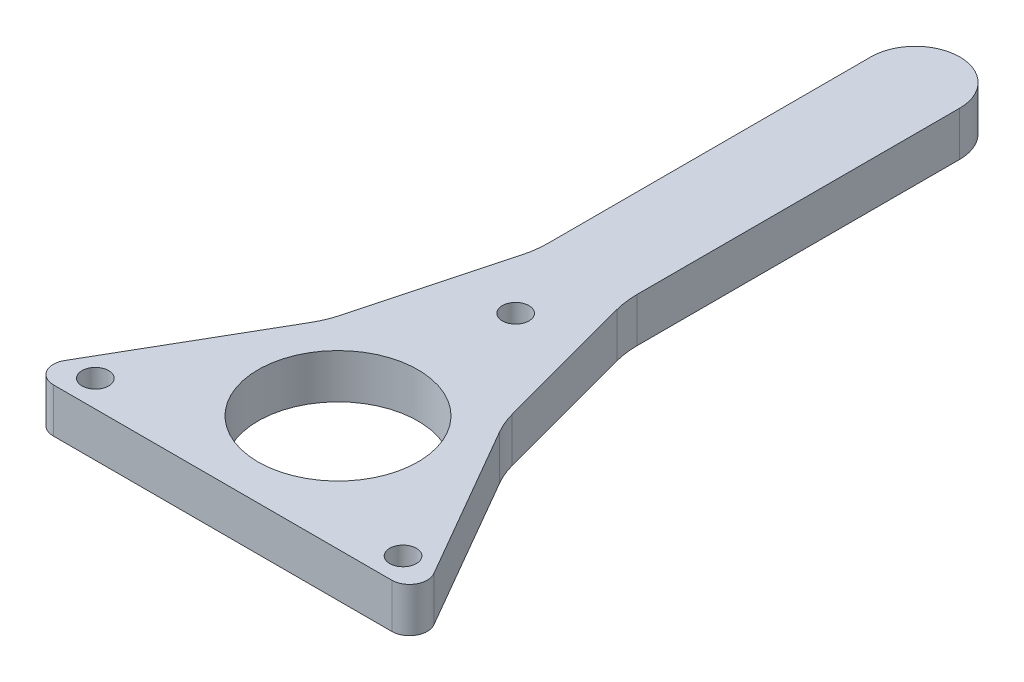
ISO-10303-21;
HEADER;
FILE_DESCRIPTION(('STEP AP214'),'2;1');
FILE_NAME('part.step','',(''),(''),'','','');
FILE_SCHEMA(('AUTOMOTIVE_DESIGN { 1 0 10303 214 1 1 1 1 }'));
ENDSEC;
DATA;
#1=APPLICATION_CONTEXT('core data for automotive mechanical design processes');
#2=APPLICATION_PROTOCOL_DEFINITION('international standard','automotive_design',2000,#1);
#3=PRODUCT_CONTEXT('',#1,'mechanical');
#4=PRODUCT('Part','Part','',(#3));
#5=PRODUCT_RELATED_PRODUCT_CATEGORY('part','',(#4));
#6=PRODUCT_DEFINITION_FORMATION('','',#4);
#7=PRODUCT_DEFINITION_CONTEXT('part definition',#1,'design');
#8=PRODUCT_DEFINITION('design','',#6,#7);
#9=PRODUCT_DEFINITION_SHAPE('','',#8);
#10=(LENGTH_UNIT() NAMED_UNIT(*) SI_UNIT(.MILLI.,.METRE.));
#11=(NAMED_UNIT(*) PLANE_ANGLE_UNIT() SI_UNIT($,.RADIAN.));
#12=(NAMED_UNIT(*) SI_UNIT($,.STERADIAN.) SOLID_ANGLE_UNIT());
#13=UNCERTAINTY_MEASURE_WITH_UNIT(LENGTH_MEASURE(1.E-05),#10,'distance_accuracy_value','');
#14=(GEOMETRIC_REPRESENTATION_CONTEXT(3) GLOBAL_UNCERTAINTY_ASSIGNED_CONTEXT((#13)) GLOBAL_UNIT_ASSIGNED_CONTEXT((#10,
#11,#12)) REPRESENTATION_CONTEXT('',''));
#15=CARTESIAN_POINT('',(0.,0.,0.));
#16=DIRECTION('',(0.,0.,1.));
#17=DIRECTION('',(1.,0.,0.));
#18=AXIS2_PLACEMENT_3D('',#15,#16,#17);
#19=CARTESIAN_POINT('',(11.2583302491977,5.,-6.5));
#20=DIRECTION('',(-0.866025403784439,0.,0.5));
#21=DIRECTION('',(0.5,0.,0.866025403784439));
#22=AXIS2_PLACEMENT_3D('',#19,#20,#21);
#23=PLANE('',#22);
#24=DIRECTION('',(-0.5,0.,-0.866025403784439));
#25=VECTOR('',#24,1.);
#26=CARTESIAN_POINT('',(11.2583302491977,0.,-6.5));
#27=LINE('',#26,#25);
#28=CARTESIAN_POINT('',(20.7846096908265,0.,10.));
#29=VERTEX_POINT('',#28);
#30=CARTESIAN_POINT('',(10.6582624879369,0.,-7.5393478504878));
#31=VERTEX_POINT('',#30);
#32=EDGE_CURVE('E197',#29,#31,#27,.T.);
#33=ORIENTED_EDGE('',*,*,#32,.T.);
#34=DIRECTION('',(0.,-1.,0.));
#35=VECTOR('',#34,1.);
#36=CARTESIAN_POINT('',(10.6582624879369,5.,-7.5393478504878));
#37=LINE('',#36,#35);
#38=CARTESIAN_POINT('',(10.6582624879369,5.,-7.5393478504878));
#39=VERTEX_POINT('',#38);
#40=EDGE_CURVE('E260',#31,#39,#37,.F.);
#41=ORIENTED_EDGE('',*,*,#40,.T.);
#42=DIRECTION('',(-0.5,0.,-0.866025403784439));
#43=VECTOR('',#42,1.);
#44=CARTESIAN_POINT('',(11.2583302491977,5.,-6.5));
#45=LINE('',#44,#43);
#46=CARTESIAN_POINT('',(20.7846096908265,5.,10.));
#47=VERTEX_POINT('',#46);
#48=EDGE_CURVE('E159',#47,#39,#45,.T.);
#49=ORIENTED_EDGE('',*,*,#48,.F.);
#50=DIRECTION('',(0.,-1.,0.));
#51=VECTOR('',#50,1.);
#52=CARTESIAN_POINT('',(20.7846096908265,5.,10.));
#53=LINE('',#52,#51);
#54=EDGE_CURVE('E238',#47,#29,#53,.T.);
#55=ORIENTED_EDGE('',*,*,#54,.T.);
#56=EDGE_LOOP('',(#33,#41,#49,#55));
#57=FACE_BOUND('',#56,.T.);
#58=ADVANCED_FACE('F44',(#57),#23,.F.);
#59=CARTESIAN_POINT('',(5.,5.,0.));
#60=DIRECTION('',(-1.,0.,0.));
#61=DIRECTION('',(0.,0.,1.));
#62=AXIS2_PLACEMENT_3D('',#59,#60,#61);
#63=PLANE('',#62);
#64=DIRECTION('',(0.,0.,-1.));
#65=VECTOR('',#64,1.);
#66=CARTESIAN_POINT('',(5.,5.,0.));
#67=LINE('',#66,#65);
#68=CARTESIAN_POINT('',(5.,5.,-28.6562709380294));
#69=VERTEX_POINT('',#68);
#70=CARTESIAN_POINT('',(5.,5.,-65.));
#71=VERTEX_POINT('',#70);
#72=EDGE_CURVE('E143',#69,#71,#67,.T.);
#73=ORIENTED_EDGE('',*,*,#72,.F.);
#74=DIRECTION('',(0.,1.,0.));
#75=VECTOR('',#74,1.);
#76=CARTESIAN_POINT('',(5.,0.,-28.6562709380294));
#77=LINE('',#76,#75);
#78=CARTESIAN_POINT('',(5.,0.,-28.6562709380294));
#79=VERTEX_POINT('',#78);
#80=EDGE_CURVE('E252',#69,#79,#77,.F.);
#81=ORIENTED_EDGE('',*,*,#80,.T.);
#82=DIRECTION('',(0.,0.,-1.));
#83=VECTOR('',#82,1.);
#84=CARTESIAN_POINT('',(5.,0.,0.));
#85=LINE('',#84,#83);
#86=CARTESIAN_POINT('',(5.,0.,-65.));
#87=VERTEX_POINT('',#86);
#88=EDGE_CURVE('E164',#79,#87,#85,.T.);
#89=ORIENTED_EDGE('',*,*,#88,.T.);
#90=DIRECTION('',(0.,-1.,0.));
#91=VECTOR('',#90,1.);
#92=CARTESIAN_POINT('',(5.,5.,-65.));
#93=LINE('',#92,#91);
#94=EDGE_CURVE('E162',#71,#87,#93,.T.);
#95=ORIENTED_EDGE('',*,*,#94,.F.);
#96=EDGE_LOOP('',(#73,#81,#89,#95));
#97=FACE_BOUND('',#96,.T.);
#98=ADVANCED_FACE('F161',(#97),#63,.F.);
#99=CARTESIAN_POINT('',(0.,5.,-65.));
#100=DIRECTION('',(0.,-1.,0.));
#101=DIRECTION('',(0.,0.,-1.));
#102=AXIS2_PLACEMENT_3D('',#99,#100,#101);
#103=CYLINDRICAL_SURFACE('',#102,5.);
#104=CARTESIAN_POINT('',(0.,0.,-65.));
#105=DIRECTION('',(0.,1.,0.));
#106=DIRECTION('',(0.,0.,1.));
#107=AXIS2_PLACEMENT_3D('',#104,#105,#106);
#108=CIRCLE('',#107,5.);
#109=CARTESIAN_POINT('',(-5.,0.,-65.));
#110=VERTEX_POINT('',#109);
#111=EDGE_CURVE('E198',#87,#110,#108,.T.);
#112=ORIENTED_EDGE('',*,*,#111,.T.);
#113=DIRECTION('',(0.,-1.,0.));
#114=VECTOR('',#113,1.);
#115=CARTESIAN_POINT('',(-5.,5.,-65.));
#116=LINE('',#115,#114);
#117=CARTESIAN_POINT('',(-5.,5.,-65.));
#118=VERTEX_POINT('',#117);
#119=EDGE_CURVE('E167',#118,#110,#116,.T.);
#120=ORIENTED_EDGE('',*,*,#119,.F.);
#121=CARTESIAN_POINT('',(0.,5.,-65.));
#122=DIRECTION('',(0.,1.,0.));
#123=DIRECTION('',(0.,0.,1.));
#124=AXIS2_PLACEMENT_3D('',#121,#122,#123);
#125=CIRCLE('',#124,5.);
#126=EDGE_CURVE('E152',#71,#118,#125,.T.);
#127=ORIENTED_EDGE('',*,*,#126,.F.);
#128=ORIENTED_EDGE('',*,*,#94,.T.);
#129=EDGE_LOOP('',(#112,#120,#127,#128));
#130=FACE_BOUND('',#129,.T.);
#131=ADVANCED_FACE('F175',(#130),#103,.T.);
#132=CARTESIAN_POINT('',(-5.,5.,0.));
#133=DIRECTION('',(-1.,0.,0.));
#134=DIRECTION('',(0.,0.,1.));
#135=AXIS2_PLACEMENT_3D('',#132,#133,#134);
#136=PLANE('',#135);
#137=DIRECTION('',(0.,0.,-1.));
#138=VECTOR('',#137,1.);
#139=CARTESIAN_POINT('',(-5.,0.,0.));
#140=LINE('',#139,#138);
#141=CARTESIAN_POINT('',(-5.,0.,-28.6562709380294));
#142=VERTEX_POINT('',#141);
#143=EDGE_CURVE('E205',#142,#110,#140,.T.);
#144=ORIENTED_EDGE('',*,*,#143,.F.);
#145=DIRECTION('',(0.,1.,0.));
#146=VECTOR('',#145,1.);
#147=CARTESIAN_POINT('',(-5.,5.,-28.6562709380294));
#148=LINE('',#147,#146);
#149=CARTESIAN_POINT('',(-5.,5.,-28.6562709380294));
#150=VERTEX_POINT('',#149);
#151=EDGE_CURVE('E270',#142,#150,#148,.T.);
#152=ORIENTED_EDGE('',*,*,#151,.T.);
#153=DIRECTION('',(0.,0.,-1.));
#154=VECTOR('',#153,1.);
#155=CARTESIAN_POINT('',(-5.,5.,0.));
#156=LINE('',#155,#154);
#157=EDGE_CURVE('E172',#150,#118,#156,.T.);
#158=ORIENTED_EDGE('',*,*,#157,.T.);
#159=ORIENTED_EDGE('',*,*,#119,.T.);
#160=EDGE_LOOP('',(#144,#152,#158,#159));
#161=FACE_BOUND('',#160,.T.);
#162=ADVANCED_FACE('F287',(#161),#136,.T.);
#163=CARTESIAN_POINT('',(-11.2583302491977,5.,-6.5));
#164=DIRECTION('',(0.866025403784439,0.,0.5));
#165=DIRECTION('',(0.5,0.,-0.866025403784439));
#166=AXIS2_PLACEMENT_3D('',#163,#164,#165);
#167=PLANE('',#166);
#168=DIRECTION('',(-0.5,0.,0.866025403784439));
#169=VECTOR('',#168,1.);
#170=CARTESIAN_POINT('',(-11.2583302491977,5.,-6.5));
#171=LINE('',#170,#169);
#172=CARTESIAN_POINT('',(-10.6582624879369,5.,-7.53934785048781));
#173=VERTEX_POINT('',#172);
#174=CARTESIAN_POINT('',(-20.7846096908265,5.,10.));
#175=VERTEX_POINT('',#174);
#176=EDGE_CURVE('E176',#173,#175,#171,.T.);
#177=ORIENTED_EDGE('',*,*,#176,.F.);
#178=DIRECTION('',(0.,-1.,0.));
#179=VECTOR('',#178,1.);
#180=CARTESIAN_POINT('',(-10.6582624879369,0.,-7.53934785048781));
#181=LINE('',#180,#179);
#182=CARTESIAN_POINT('',(-10.6582624879369,0.,-7.53934785048781));
#183=VERTEX_POINT('',#182);
#184=EDGE_CURVE('E258',#173,#183,#181,.T.);
#185=ORIENTED_EDGE('',*,*,#184,.T.);
#186=DIRECTION('',(-0.5,0.,0.866025403784439));
#187=VECTOR('',#186,1.);
#188=CARTESIAN_POINT('',(-11.2583302491977,0.,-6.5));
#189=LINE('',#188,#187);
#190=CARTESIAN_POINT('',(-20.7846096908265,0.,10.));
#191=VERTEX_POINT('',#190);
#192=EDGE_CURVE('E204',#183,#191,#189,.T.);
#193=ORIENTED_EDGE('',*,*,#192,.T.);
#194=DIRECTION('',(0.,-1.,0.));
#195=VECTOR('',#194,1.);
#196=CARTESIAN_POINT('',(-20.7846096908265,5.,10.));
#197=LINE('',#196,#195);
#198=EDGE_CURVE('E233',#191,#175,#197,.F.);
#199=ORIENTED_EDGE('',*,*,#198,.T.);
#200=EDGE_LOOP('',(#177,#185,#193,#199));
#201=FACE_BOUND('',#200,.T.);
#202=ADVANCED_FACE('F377',(#201),#167,.F.);
#203=CARTESIAN_POINT('',(17.3205080756888,5.,10.));
#204=DIRECTION('',(0.,-1.,0.));
#205=DIRECTION('',(0.,0.,-1.));
#206=AXIS2_PLACEMENT_3D('',#203,#204,#205);
#207=CYLINDRICAL_SURFACE('',#206,1.5);
#208=CARTESIAN_POINT('',(17.3205080756888,5.,10.));
#209=DIRECTION('',(0.,1.,0.));
#210=DIRECTION('',(0.,0.,1.));
#211=AXIS2_PLACEMENT_3D('',#208,#209,#210);
#212=CIRCLE('',#211,1.5);
#213=CARTESIAN_POINT('',(17.3205080756888,5.,11.5));
#214=VERTEX_POINT('',#213);
#215=EDGE_CURVE('E188',#214,#214,#212,.T.);
#216=ORIENTED_EDGE('',*,*,#215,.T.);
#217=EDGE_LOOP('',(#216));
#218=FACE_BOUND('',#217,.T.);
#219=CARTESIAN_POINT('',(17.3205080756888,0.,10.));
#220=DIRECTION('',(0.,1.,0.));
#221=DIRECTION('',(0.,0.,1.));
#222=AXIS2_PLACEMENT_3D('',#219,#220,#221);
#223=CIRCLE('',#222,1.5);
#224=CARTESIAN_POINT('',(17.3205080756888,0.,11.5));
#225=VERTEX_POINT('',#224);
#226=EDGE_CURVE('E213',#225,#225,#223,.T.);
#227=ORIENTED_EDGE('',*,*,#226,.F.);
#228=EDGE_LOOP('',(#227));
#229=FACE_BOUND('',#228,.T.);
#230=ADVANCED_FACE('F408',(#218,#229),#207,.F.);
#231=CARTESIAN_POINT('',(-17.3205080756888,5.,10.));
#232=DIRECTION('',(0.,-1.,0.));
#233=DIRECTION('',(0.,0.,-1.));
#234=AXIS2_PLACEMENT_3D('',#231,#232,#233);
#235=CYLINDRICAL_SURFACE('',#234,1.5);
#236=CARTESIAN_POINT('',(-17.3205080756888,5.,10.));
#237=DIRECTION('',(0.,1.,0.));
#238=DIRECTION('',(0.,0.,1.));
#239=AXIS2_PLACEMENT_3D('',#236,#237,#238);
#240=CIRCLE('',#239,1.5);
#241=CARTESIAN_POINT('',(-17.3205080756888,5.,11.5));
#242=VERTEX_POINT('',#241);
#243=EDGE_CURVE('E190',#242,#242,#240,.T.);
#244=ORIENTED_EDGE('',*,*,#243,.T.);
#245=EDGE_LOOP('',(#244));
#246=FACE_BOUND('',#245,.T.);
#247=CARTESIAN_POINT('',(-17.3205080756888,0.,10.));
#248=DIRECTION('',(0.,1.,0.));
#249=DIRECTION('',(0.,0.,1.));
#250=AXIS2_PLACEMENT_3D('',#247,#248,#249);
#251=CIRCLE('',#250,1.5);
#252=CARTESIAN_POINT('',(-17.3205080756888,0.,11.5));
#253=VERTEX_POINT('',#252);
#254=EDGE_CURVE('E215',#253,#253,#251,.T.);
#255=ORIENTED_EDGE('',*,*,#254,.F.);
#256=EDGE_LOOP('',(#255));
#257=FACE_BOUND('',#256,.T.);
#258=ADVANCED_FACE('F401',(#246,#257),#235,.F.);
#259=CARTESIAN_POINT('',(0.,5.,0.));
#260=DIRECTION('',(0.,-1.,0.));
#261=DIRECTION('',(0.,0.,-1.));
#262=AXIS2_PLACEMENT_3D('',#259,#260,#261);
#263=CYLINDRICAL_SURFACE('',#262,9.);
#264=CARTESIAN_POINT('',(0.,5.,0.));
#265=DIRECTION('',(0.,1.,0.));
#266=DIRECTION('',(0.,0.,1.));
#267=AXIS2_PLACEMENT_3D('',#264,#265,#266);
#268=CIRCLE('',#267,9.);
#269=CARTESIAN_POINT('',(0.,5.,9.));
#270=VERTEX_POINT('',#269);
#271=EDGE_CURVE('E183',#270,#270,#268,.T.);
#272=ORIENTED_EDGE('',*,*,#271,.T.);
#273=EDGE_LOOP('',(#272));
#274=FACE_BOUND('',#273,.T.);
#275=CARTESIAN_POINT('',(0.,0.,0.));
#276=DIRECTION('',(0.,1.,0.));
#277=DIRECTION('',(0.,0.,1.));
#278=AXIS2_PLACEMENT_3D('',#275,#276,#277);
#279=CIRCLE('',#278,9.);
#280=CARTESIAN_POINT('',(0.,0.,9.));
#281=VERTEX_POINT('',#280);
#282=EDGE_CURVE('E209',#281,#281,#279,.T.);
#283=ORIENTED_EDGE('',*,*,#282,.F.);
#284=EDGE_LOOP('',(#283));
#285=FACE_BOUND('',#284,.T.);
#286=ADVANCED_FACE('F393',(#274,#285),#263,.F.);
#287=CARTESIAN_POINT('',(0.,5.,13.));
#288=DIRECTION('',(0.,0.,-1.));
#289=DIRECTION('',(-1.,0.,0.));
#290=AXIS2_PLACEMENT_3D('',#287,#288,#289);
#291=PLANE('',#290);
#292=DIRECTION('',(1.,0.,0.));
#293=VECTOR('',#292,1.);
#294=CARTESIAN_POINT('',(0.,5.,13.));
#295=LINE('',#294,#293);
#296=CARTESIAN_POINT('',(-19.0525588832577,5.,13.));
#297=VERTEX_POINT('',#296);
#298=CARTESIAN_POINT('',(19.0525588832577,5.,13.));
#299=VERTEX_POINT('',#298);
#300=EDGE_CURVE('E181',#297,#299,#295,.T.);
#301=ORIENTED_EDGE('',*,*,#300,.F.);
#302=DIRECTION('',(0.,-1.,0.));
#303=VECTOR('',#302,1.);
#304=CARTESIAN_POINT('',(-19.0525588832577,5.,13.));
#305=LINE('',#304,#303);
#306=CARTESIAN_POINT('',(-19.0525588832577,0.,13.));
#307=VERTEX_POINT('',#306);
#308=EDGE_CURVE('E223',#297,#307,#305,.T.);
#309=ORIENTED_EDGE('',*,*,#308,.T.);
#310=DIRECTION('',(1.,0.,0.));
#311=VECTOR('',#310,1.);
#312=CARTESIAN_POINT('',(0.,0.,13.));
#313=LINE('',#312,#311);
#314=CARTESIAN_POINT('',(19.0525588832577,0.,13.));
#315=VERTEX_POINT('',#314);
#316=EDGE_CURVE('E207',#307,#315,#313,.T.);
#317=ORIENTED_EDGE('',*,*,#316,.T.);
#318=DIRECTION('',(0.,-1.,0.));
#319=VECTOR('',#318,1.);
#320=CARTESIAN_POINT('',(19.0525588832577,5.,13.));
#321=LINE('',#320,#319);
#322=EDGE_CURVE('E169',#315,#299,#321,.F.);
#323=ORIENTED_EDGE('',*,*,#322,.T.);
#324=EDGE_LOOP('',(#301,#309,#317,#323));
#325=FACE_BOUND('',#324,.T.);
#326=ADVANCED_FACE('F387',(#325),#291,.F.);
#327=CARTESIAN_POINT('',(0.,5.,-20.));
#328=DIRECTION('',(0.,-1.,0.));
#329=DIRECTION('',(0.,0.,-1.));
#330=AXIS2_PLACEMENT_3D('',#327,#328,#329);
#331=CYLINDRICAL_SURFACE('',#330,1.5);
#332=CARTESIAN_POINT('',(0.,5.,-20.));
#333=DIRECTION('',(0.,1.,0.));
#334=DIRECTION('',(0.,0.,1.));
#335=AXIS2_PLACEMENT_3D('',#332,#333,#334);
#336=CIRCLE('',#335,1.5);
#337=CARTESIAN_POINT('',(0.,5.,-18.5));
#338=VERTEX_POINT('',#337);
#339=EDGE_CURVE('E194',#338,#338,#336,.T.);
#340=ORIENTED_EDGE('',*,*,#339,.T.);
#341=EDGE_LOOP('',(#340));
#342=FACE_BOUND('',#341,.T.);
#343=CARTESIAN_POINT('',(0.,0.,-20.));
#344=DIRECTION('',(0.,1.,0.));
#345=DIRECTION('',(0.,0.,1.));
#346=AXIS2_PLACEMENT_3D('',#343,#344,#345);
#347=CIRCLE('',#346,1.5);
#348=CARTESIAN_POINT('',(0.,0.,-18.5));
#349=VERTEX_POINT('',#348);
#350=EDGE_CURVE('E220',#349,#349,#347,.T.);
#351=ORIENTED_EDGE('',*,*,#350,.F.);
#352=EDGE_LOOP('',(#351));
#353=FACE_BOUND('',#352,.T.);
#354=ADVANCED_FACE('F391',(#342,#353),#331,.F.);
#355=CARTESIAN_POINT('',(0.,5.,0.));
#356=DIRECTION('',(0.,1.,0.));
#357=DIRECTION('',(0.,0.,1.));
#358=AXIS2_PLACEMENT_3D('',#355,#356,#357);
#359=PLANE('',#358);
#360=ORIENTED_EDGE('',*,*,#157,.F.);
#361=CARTESIAN_POINT('',(-15.,5.,-28.6562709380294));
#362=DIRECTION('',(0.,1.,0.));
#363=DIRECTION('',(0.,0.,1.));
#364=AXIS2_PLACEMENT_3D('',#361,#362,#363);
#365=CIRCLE('',#364,10.);
#366=CARTESIAN_POINT('',(-5.34074173710932,5.,-26.0680804870042));
#367=VERTEX_POINT('',#366);
#368=EDGE_CURVE('E52',#150,#367,#365,.F.);
#369=ORIENTED_EDGE('',*,*,#368,.T.);
#370=DIRECTION('',(-0.258819045102521,0.,0.965925826289068));
#371=VECTOR('',#370,1.);
#372=CARTESIAN_POINT('',(-9.99999999999993,5.,-8.67949192431135));
#373=LINE('',#372,#371);
#374=CARTESIAN_POINT('',(-9.65925826289061,5.,-9.9511573994626));
#375=VERTEX_POINT('',#374);
#376=EDGE_CURVE('E247',#367,#375,#373,.T.);
#377=ORIENTED_EDGE('',*,*,#376,.T.);
#378=CARTESIAN_POINT('',(-19.3185165257813,5.,-12.5393478504878));
#379=DIRECTION('',(0.,1.,0.));
#380=DIRECTION('',(0.,0.,1.));
#381=AXIS2_PLACEMENT_3D('',#378,#379,#380);
#382=CIRCLE('',#381,10.);
#383=EDGE_CURVE('E279',#375,#173,#382,.F.);
#384=ORIENTED_EDGE('',*,*,#383,.T.);
#385=ORIENTED_EDGE('',*,*,#176,.T.);
#386=CARTESIAN_POINT('',(-19.0525588832577,5.,11.));
#387=DIRECTION('',(0.,1.,0.));
#388=DIRECTION('',(0.,0.,1.));
#389=AXIS2_PLACEMENT_3D('',#386,#387,#388);
#390=CIRCLE('',#389,2.);
#391=EDGE_CURVE('E236',#175,#297,#390,.T.);
#392=ORIENTED_EDGE('',*,*,#391,.T.);
#393=ORIENTED_EDGE('',*,*,#300,.T.);
#394=CARTESIAN_POINT('',(19.0525588832577,5.,11.));
#395=DIRECTION('',(0.,1.,0.));
#396=DIRECTION('',(0.,0.,1.));
#397=AXIS2_PLACEMENT_3D('',#394,#395,#396);
#398=CIRCLE('',#397,2.);
#399=EDGE_CURVE('E234',#299,#47,#398,.T.);
#400=ORIENTED_EDGE('',*,*,#399,.T.);
#401=ORIENTED_EDGE('',*,*,#48,.T.);
#402=CARTESIAN_POINT('',(19.3185165257813,5.,-12.5393478504878));
#403=DIRECTION('',(0.,1.,0.));
#404=DIRECTION('',(0.,0.,1.));
#405=AXIS2_PLACEMENT_3D('',#402,#403,#404);
#406=CIRCLE('',#405,10.);
#407=CARTESIAN_POINT('',(9.65925826289061,5.,-9.9511573994626));
#408=VERTEX_POINT('',#407);
#409=EDGE_CURVE('E275',#39,#408,#406,.F.);
#410=ORIENTED_EDGE('',*,*,#409,.T.);
#411=DIRECTION('',(0.258819045102521,0.,0.965925826289068));
#412=VECTOR('',#411,1.);
#413=CARTESIAN_POINT('',(5.,5.,-27.3397459621555));
#414=LINE('',#413,#412);
#415=CARTESIAN_POINT('',(5.34074173710932,5.,-26.0680804870042));
#416=VERTEX_POINT('',#415);
#417=EDGE_CURVE('E242',#408,#416,#414,.F.);
#418=ORIENTED_EDGE('',*,*,#417,.T.);
#419=CARTESIAN_POINT('',(15.,5.,-28.6562709380294));
#420=DIRECTION('',(0.,1.,0.));
#421=DIRECTION('',(0.,0.,1.));
#422=AXIS2_PLACEMENT_3D('',#419,#420,#421);
#423=CIRCLE('',#422,10.);
#424=EDGE_CURVE('E153',#416,#69,#423,.F.);
#425=ORIENTED_EDGE('',*,*,#424,.T.);
#426=ORIENTED_EDGE('',*,*,#72,.T.);
#427=ORIENTED_EDGE('',*,*,#126,.T.);
#428=EDGE_LOOP('',(#360,#369,#377,#384,#385,#392,#393,#400,#401,#410,#418,#425,#426,#427));
#429=FACE_BOUND('',#428,.T.);
#430=ORIENTED_EDGE('',*,*,#271,.F.);
#431=EDGE_LOOP('',(#430));
#432=FACE_BOUND('',#431,.T.);
#433=ORIENTED_EDGE('',*,*,#243,.F.);
#434=EDGE_LOOP('',(#433));
#435=FACE_BOUND('',#434,.T.);
#436=ORIENTED_EDGE('',*,*,#215,.F.);
#437=EDGE_LOOP('',(#436));
#438=FACE_BOUND('',#437,.T.);
#439=ORIENTED_EDGE('',*,*,#339,.F.);
#440=EDGE_LOOP('',(#439));
#441=FACE_BOUND('',#440,.T.);
#442=ADVANCED_FACE('F149',(#429,#432,#435,#438,#441),#359,.T.);
#443=CARTESIAN_POINT('',(0.,0.,0.));
#444=DIRECTION('',(0.,1.,0.));
#445=DIRECTION('',(0.,0.,1.));
#446=AXIS2_PLACEMENT_3D('',#443,#444,#445);
#447=PLANE('',#446);
#448=ORIENTED_EDGE('',*,*,#316,.F.);
#449=CARTESIAN_POINT('',(-19.0525588832577,0.,11.));
#450=DIRECTION('',(0.,1.,0.));
#451=DIRECTION('',(0.,0.,1.));
#452=AXIS2_PLACEMENT_3D('',#449,#450,#451);
#453=CIRCLE('',#452,2.);
#454=EDGE_CURVE('E226',#307,#191,#453,.F.);
#455=ORIENTED_EDGE('',*,*,#454,.T.);
#456=ORIENTED_EDGE('',*,*,#192,.F.);
#457=CARTESIAN_POINT('',(-19.3185165257813,0.,-12.5393478504878));
#458=DIRECTION('',(0.,1.,0.));
#459=DIRECTION('',(0.,0.,1.));
#460=AXIS2_PLACEMENT_3D('',#457,#458,#459);
#461=CIRCLE('',#460,10.);
#462=CARTESIAN_POINT('',(-9.65925826289061,0.,-9.9511573994626));
#463=VERTEX_POINT('',#462);
#464=EDGE_CURVE('E277',#183,#463,#461,.T.);
#465=ORIENTED_EDGE('',*,*,#464,.T.);
#466=DIRECTION('',(0.258819045102521,0.,-0.965925826289068));
#467=VECTOR('',#466,1.);
#468=CARTESIAN_POINT('',(-11.5,0.,-3.0814157129579));
#469=LINE('',#468,#467);
#470=CARTESIAN_POINT('',(-5.34074173710931,0.,-26.0680804870042));
#471=VERTEX_POINT('',#470);
#472=EDGE_CURVE('E246',#463,#471,#469,.T.);
#473=ORIENTED_EDGE('',*,*,#472,.T.);
#474=CARTESIAN_POINT('',(-15.,0.,-28.6562709380294));
#475=DIRECTION('',(0.,1.,0.));
#476=DIRECTION('',(0.,0.,1.));
#477=AXIS2_PLACEMENT_3D('',#474,#475,#476);
#478=CIRCLE('',#477,10.);
#479=EDGE_CURVE('E11',#471,#142,#478,.T.);
#480=ORIENTED_EDGE('',*,*,#479,.T.);
#481=ORIENTED_EDGE('',*,*,#143,.T.);
#482=ORIENTED_EDGE('',*,*,#111,.F.);
#483=ORIENTED_EDGE('',*,*,#88,.F.);
#484=CARTESIAN_POINT('',(15.,0.,-28.6562709380294));
#485=DIRECTION('',(0.,1.,0.));
#486=DIRECTION('',(0.,0.,1.));
#487=AXIS2_PLACEMENT_3D('',#484,#485,#486);
#488=CIRCLE('',#487,10.);
#489=CARTESIAN_POINT('',(5.34074173710931,0.,-26.0680804870042));
#490=VERTEX_POINT('',#489);
#491=EDGE_CURVE('E269',#79,#490,#488,.T.);
#492=ORIENTED_EDGE('',*,*,#491,.T.);
#493=DIRECTION('',(-0.258819045102521,0.,-0.965925826289068));
#494=VECTOR('',#493,1.);
#495=CARTESIAN_POINT('',(11.5,0.,-3.0814157129579));
#496=LINE('',#495,#494);
#497=CARTESIAN_POINT('',(9.65925826289061,0.,-9.9511573994626));
#498=VERTEX_POINT('',#497);
#499=EDGE_CURVE('E241',#490,#498,#496,.F.);
#500=ORIENTED_EDGE('',*,*,#499,.T.);
#501=CARTESIAN_POINT('',(19.3185165257813,0.,-12.5393478504878));
#502=DIRECTION('',(0.,1.,0.));
#503=DIRECTION('',(0.,0.,1.));
#504=AXIS2_PLACEMENT_3D('',#501,#502,#503);
#505=CIRCLE('',#504,10.);
#506=EDGE_CURVE('E274',#498,#31,#505,.T.);
#507=ORIENTED_EDGE('',*,*,#506,.T.);
#508=ORIENTED_EDGE('',*,*,#32,.F.);
#509=CARTESIAN_POINT('',(19.0525588832577,0.,11.));
#510=DIRECTION('',(0.,1.,0.));
#511=DIRECTION('',(0.,0.,1.));
#512=AXIS2_PLACEMENT_3D('',#509,#510,#511);
#513=CIRCLE('',#512,2.);
#514=EDGE_CURVE('E228',#29,#315,#513,.F.);
#515=ORIENTED_EDGE('',*,*,#514,.T.);
#516=EDGE_LOOP('',(#448,#455,#456,#465,#473,#480,#481,#482,#483,#492,#500,#507,#508,#515));
#517=FACE_BOUND('',#516,.T.);
#518=ORIENTED_EDGE('',*,*,#282,.T.);
#519=EDGE_LOOP('',(#518));
#520=FACE_BOUND('',#519,.T.);
#521=ORIENTED_EDGE('',*,*,#254,.T.);
#522=EDGE_LOOP('',(#521));
#523=FACE_BOUND('',#522,.T.);
#524=ORIENTED_EDGE('',*,*,#226,.T.);
#525=EDGE_LOOP('',(#524));
#526=FACE_BOUND('',#525,.T.);
#527=ORIENTED_EDGE('',*,*,#350,.T.);
#528=EDGE_LOOP('',(#527));
#529=FACE_BOUND('',#528,.T.);
#530=ADVANCED_FACE('F288',(#517,#520,#523,#526,#529),#447,.F.);
#531=CARTESIAN_POINT('',(-19.0525588832577,5.,11.));
#532=DIRECTION('',(0.,-1.,0.));
#533=DIRECTION('',(0.,0.,-1.));
#534=AXIS2_PLACEMENT_3D('',#531,#532,#533);
#535=CYLINDRICAL_SURFACE('',#534,2.);
#536=ORIENTED_EDGE('',*,*,#391,.F.);
#537=ORIENTED_EDGE('',*,*,#198,.F.);
#538=ORIENTED_EDGE('',*,*,#454,.F.);
#539=ORIENTED_EDGE('',*,*,#308,.F.);
#540=EDGE_LOOP('',(#536,#537,#538,#539));
#541=FACE_BOUND('',#540,.T.);
#542=ADVANCED_FACE('F318',(#541),#535,.T.);
#543=CARTESIAN_POINT('',(19.0525588832577,5.,11.));
#544=DIRECTION('',(0.,-1.,0.));
#545=DIRECTION('',(0.,0.,-1.));
#546=AXIS2_PLACEMENT_3D('',#543,#544,#545);
#547=CYLINDRICAL_SURFACE('',#546,2.);
#548=ORIENTED_EDGE('',*,*,#399,.F.);
#549=ORIENTED_EDGE('',*,*,#322,.F.);
#550=ORIENTED_EDGE('',*,*,#514,.F.);
#551=ORIENTED_EDGE('',*,*,#54,.F.);
#552=EDGE_LOOP('',(#548,#549,#550,#551));
#553=FACE_BOUND('',#552,.T.);
#554=ADVANCED_FACE('F324',(#553),#547,.T.);
#555=CARTESIAN_POINT('',(5.,5.,-27.3397459621555));
#556=DIRECTION('',(0.965925826289068,0.,-0.258819045102521));
#557=DIRECTION('',(0.,1.,0.));
#558=AXIS2_PLACEMENT_3D('',#555,#556,#557);
#559=PLANE('',#558);
#560=ORIENTED_EDGE('',*,*,#499,.F.);
#561=DIRECTION('',(0.,-1.,0.));
#562=VECTOR('',#561,1.);
#563=CARTESIAN_POINT('',(5.34074173710932,5.,-26.0680804870042));
#564=LINE('',#563,#562);
#565=EDGE_CURVE('E253',#490,#416,#564,.F.);
#566=ORIENTED_EDGE('',*,*,#565,.T.);
#567=ORIENTED_EDGE('',*,*,#417,.F.);
#568=DIRECTION('',(0.,1.,0.));
#569=VECTOR('',#568,1.);
#570=CARTESIAN_POINT('',(9.65925826289061,0.,-9.9511573994626));
#571=LINE('',#570,#569);
#572=EDGE_CURVE('E254',#408,#498,#571,.F.);
#573=ORIENTED_EDGE('',*,*,#572,.T.);
#574=EDGE_LOOP('',(#560,#566,#567,#573));
#575=FACE_BOUND('',#574,.T.);
#576=ADVANCED_FACE('F294',(#575),#559,.T.);
#577=CARTESIAN_POINT('',(-9.99999999999993,5.,-8.67949192431135));
#578=DIRECTION('',(0.965925826289068,0.,0.258819045102521));
#579=DIRECTION('',(0.,-1.,0.));
#580=AXIS2_PLACEMENT_3D('',#577,#578,#579);
#581=PLANE('',#580);
#582=ORIENTED_EDGE('',*,*,#472,.F.);
#583=DIRECTION('',(0.,-1.,0.));
#584=VECTOR('',#583,1.);
#585=CARTESIAN_POINT('',(-9.65925826289062,5.,-9.9511573994626));
#586=LINE('',#585,#584);
#587=EDGE_CURVE('E263',#463,#375,#586,.F.);
#588=ORIENTED_EDGE('',*,*,#587,.T.);
#589=ORIENTED_EDGE('',*,*,#376,.F.);
#590=DIRECTION('',(0.,1.,0.));
#591=VECTOR('',#590,1.);
#592=CARTESIAN_POINT('',(-5.34074173710932,5.,-26.0680804870042));
#593=LINE('',#592,#591);
#594=EDGE_CURVE('E265',#367,#471,#593,.F.);
#595=ORIENTED_EDGE('',*,*,#594,.T.);
#596=EDGE_LOOP('',(#582,#588,#589,#595));
#597=FACE_BOUND('',#596,.T.);
#598=ADVANCED_FACE('F285',(#597),#581,.F.);
#599=CARTESIAN_POINT('',(15.,5.,-28.6562709380294));
#600=DIRECTION('',(0.,-1.,0.));
#601=DIRECTION('',(0.,0.,-1.));
#602=AXIS2_PLACEMENT_3D('',#599,#600,#601);
#603=CYLINDRICAL_SURFACE('',#602,10.);
#604=ORIENTED_EDGE('',*,*,#424,.F.);
#605=ORIENTED_EDGE('',*,*,#565,.F.);
#606=ORIENTED_EDGE('',*,*,#491,.F.);
#607=ORIENTED_EDGE('',*,*,#80,.F.);
#608=EDGE_LOOP('',(#604,#605,#606,#607));
#609=FACE_BOUND('',#608,.T.);
#610=ADVANCED_FACE('F296',(#609),#603,.F.);
#611=CARTESIAN_POINT('',(19.3185165257813,5.,-12.5393478504878));
#612=DIRECTION('',(0.,1.,0.));
#613=DIRECTION('',(0.,0.,1.));
#614=AXIS2_PLACEMENT_3D('',#611,#612,#613);
#615=CYLINDRICAL_SURFACE('',#614,10.);
#616=ORIENTED_EDGE('',*,*,#506,.F.);
#617=ORIENTED_EDGE('',*,*,#572,.F.);
#618=ORIENTED_EDGE('',*,*,#409,.F.);
#619=ORIENTED_EDGE('',*,*,#40,.F.);
#620=EDGE_LOOP('',(#616,#617,#618,#619));
#621=FACE_BOUND('',#620,.T.);
#622=ADVANCED_FACE('F297',(#621),#615,.F.);
#623=CARTESIAN_POINT('',(-19.3185165257813,5.,-12.5393478504878));
#624=DIRECTION('',(0.,1.,0.));
#625=DIRECTION('',(0.,0.,1.));
#626=AXIS2_PLACEMENT_3D('',#623,#624,#625);
#627=CYLINDRICAL_SURFACE('',#626,10.);
#628=ORIENTED_EDGE('',*,*,#383,.F.);
#629=ORIENTED_EDGE('',*,*,#587,.F.);
#630=ORIENTED_EDGE('',*,*,#464,.F.);
#631=ORIENTED_EDGE('',*,*,#184,.F.);
#632=EDGE_LOOP('',(#628,#629,#630,#631));
#633=FACE_BOUND('',#632,.T.);
#634=ADVANCED_FACE('F306',(#633),#627,.F.);
#635=CARTESIAN_POINT('',(-15.,5.,-28.6562709380294));
#636=DIRECTION('',(0.,1.,0.));
#637=DIRECTION('',(0.,0.,1.));
#638=AXIS2_PLACEMENT_3D('',#635,#636,#637);
#639=CYLINDRICAL_SURFACE('',#638,10.);
#640=ORIENTED_EDGE('',*,*,#479,.F.);
#641=ORIENTED_EDGE('',*,*,#594,.F.);
#642=ORIENTED_EDGE('',*,*,#368,.F.);
#643=ORIENTED_EDGE('',*,*,#151,.F.);
#644=EDGE_LOOP('',(#640,#641,#642,#643));
#645=FACE_BOUND('',#644,.T.);
#646=ADVANCED_FACE('F50',(#645),#639,.F.);
#647=CLOSED_SHELL('',(#58,#98,#131,#162,#202,#230,#258,#286,#326,#354,#442,#530,#542,#554,#576,
#598,#610,#622,#634,#646));
#648=MANIFOLD_SOLID_BREP('B2',#647);
#649=ADVANCED_BREP_SHAPE_REPRESENTATION('',(#18,#648),#14);
#650=SHAPE_DEFINITION_REPRESENTATION(#9,#649);
ENDSEC;
END-ISO-10303-21;
